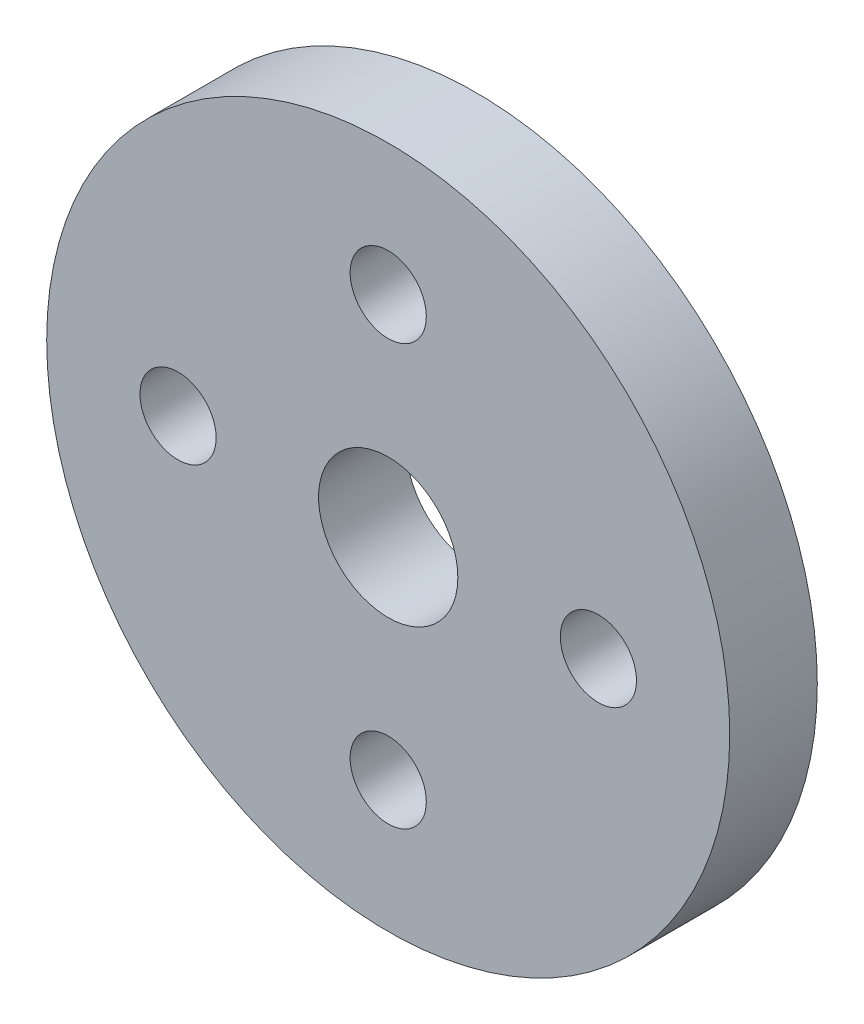
ISO-10303-21;
HEADER;
FILE_DESCRIPTION(('STEP AP214'),'2;1');
FILE_NAME('part.step','',(''),(''),'','','');
FILE_SCHEMA(('AUTOMOTIVE_DESIGN { 1 0 10303 214 1 1 1 1 }'));
ENDSEC;
DATA;
#1=APPLICATION_CONTEXT('core data for automotive mechanical design processes');
#2=APPLICATION_PROTOCOL_DEFINITION('international standard','automotive_design',2000,#1);
#3=PRODUCT_CONTEXT('',#1,'mechanical');
#4=PRODUCT('Part','Part','',(#3));
#5=PRODUCT_RELATED_PRODUCT_CATEGORY('part','',(#4));
#6=PRODUCT_DEFINITION_FORMATION('','',#4);
#7=PRODUCT_DEFINITION_CONTEXT('part definition',#1,'design');
#8=PRODUCT_DEFINITION('design','',#6,#7);
#9=PRODUCT_DEFINITION_SHAPE('','',#8);
#10=(LENGTH_UNIT() NAMED_UNIT(*) SI_UNIT(.MILLI.,.METRE.));
#11=(NAMED_UNIT(*) PLANE_ANGLE_UNIT() SI_UNIT($,.RADIAN.));
#12=(NAMED_UNIT(*) SI_UNIT($,.STERADIAN.) SOLID_ANGLE_UNIT());
#13=UNCERTAINTY_MEASURE_WITH_UNIT(LENGTH_MEASURE(1.E-05),#10,'distance_accuracy_value','');
#14=(GEOMETRIC_REPRESENTATION_CONTEXT(3) GLOBAL_UNCERTAINTY_ASSIGNED_CONTEXT((#13)) GLOBAL_UNIT_ASSIGNED_CONTEXT((#10,
#11,#12)) REPRESENTATION_CONTEXT('',''));
#15=CARTESIAN_POINT('',(0.,0.,0.));
#16=DIRECTION('',(0.,0.,1.));
#17=DIRECTION('',(1.,0.,0.));
#18=AXIS2_PLACEMENT_3D('',#15,#16,#17);
#19=CARTESIAN_POINT('',(0.,0.,5.));
#20=DIRECTION('',(0.,0.,1.));
#21=DIRECTION('',(1.,0.,0.));
#22=AXIS2_PLACEMENT_3D('',#19,#20,#21);
#23=PLANE('',#22);
#24=CARTESIAN_POINT('',(-12.,0.,5.));
#25=DIRECTION('',(0.,0.,1.));
#26=DIRECTION('',(1.,0.,0.));
#27=AXIS2_PLACEMENT_3D('',#24,#25,#26);
#28=CIRCLE('',#27,2.175);
#29=CARTESIAN_POINT('',(-9.825,0.,5.));
#30=VERTEX_POINT('',#29);
#31=EDGE_CURVE('E59',#30,#30,#28,.T.);
#32=ORIENTED_EDGE('',*,*,#31,.F.);
#33=EDGE_LOOP('',(#32));
#34=FACE_BOUND('',#33,.T.);
#35=CARTESIAN_POINT('',(12.,0.,5.));
#36=DIRECTION('',(0.,0.,1.));
#37=DIRECTION('',(1.,0.,0.));
#38=AXIS2_PLACEMENT_3D('',#35,#36,#37);
#39=CIRCLE('',#38,2.175);
#40=CARTESIAN_POINT('',(14.175,0.,5.));
#41=VERTEX_POINT('',#40);
#42=EDGE_CURVE('E47',#41,#41,#39,.T.);
#43=ORIENTED_EDGE('',*,*,#42,.F.);
#44=EDGE_LOOP('',(#43));
#45=FACE_BOUND('',#44,.T.);
#46=CARTESIAN_POINT('',(0.,0.,5.));
#47=DIRECTION('',(0.,0.,1.));
#48=DIRECTION('',(1.,0.,0.));
#49=AXIS2_PLACEMENT_3D('',#46,#47,#48);
#50=CIRCLE('',#49,19.5);
#51=CARTESIAN_POINT('',(19.5,0.,5.));
#52=VERTEX_POINT('',#51);
#53=EDGE_CURVE('E10',#52,#52,#50,.T.);
#54=ORIENTED_EDGE('',*,*,#53,.T.);
#55=EDGE_LOOP('',(#54));
#56=FACE_BOUND('',#55,.T.);
#57=CARTESIAN_POINT('',(0.,0.,5.));
#58=DIRECTION('',(0.,0.,1.));
#59=DIRECTION('',(1.,0.,0.));
#60=AXIS2_PLACEMENT_3D('',#57,#58,#59);
#61=CIRCLE('',#60,3.975);
#62=CARTESIAN_POINT('',(3.975,0.,5.));
#63=VERTEX_POINT('',#62);
#64=EDGE_CURVE('E42',#63,#63,#61,.T.);
#65=ORIENTED_EDGE('',*,*,#64,.F.);
#66=EDGE_LOOP('',(#65));
#67=FACE_BOUND('',#66,.T.);
#68=CARTESIAN_POINT('',(0.,12.,5.));
#69=DIRECTION('',(0.,0.,1.));
#70=DIRECTION('',(1.,0.,0.));
#71=AXIS2_PLACEMENT_3D('',#68,#69,#70);
#72=CIRCLE('',#71,2.175);
#73=CARTESIAN_POINT('',(2.175,12.,5.));
#74=VERTEX_POINT('',#73);
#75=EDGE_CURVE('E53',#74,#74,#72,.T.);
#76=ORIENTED_EDGE('',*,*,#75,.F.);
#77=EDGE_LOOP('',(#76));
#78=FACE_BOUND('',#77,.T.);
#79=CARTESIAN_POINT('',(0.,-12.,5.));
#80=DIRECTION('',(0.,0.,1.));
#81=DIRECTION('',(1.,0.,0.));
#82=AXIS2_PLACEMENT_3D('',#79,#80,#81);
#83=CIRCLE('',#82,2.175);
#84=CARTESIAN_POINT('',(2.175,-12.,5.));
#85=VERTEX_POINT('',#84);
#86=EDGE_CURVE('E65',#85,#85,#83,.T.);
#87=ORIENTED_EDGE('',*,*,#86,.F.);
#88=EDGE_LOOP('',(#87));
#89=FACE_BOUND('',#88,.T.);
#90=ADVANCED_FACE('F31',(#34,#45,#56,#67,#78,#89),#23,.T.);
#91=CARTESIAN_POINT('',(0.,0.,0.));
#92=DIRECTION('',(0.,0.,1.));
#93=DIRECTION('',(1.,0.,0.));
#94=AXIS2_PLACEMENT_3D('',#91,#92,#93);
#95=PLANE('',#94);
#96=CARTESIAN_POINT('',(0.,0.,0.));
#97=DIRECTION('',(0.,0.,1.));
#98=DIRECTION('',(1.,0.,0.));
#99=AXIS2_PLACEMENT_3D('',#96,#97,#98);
#100=CIRCLE('',#99,19.5);
#101=CARTESIAN_POINT('',(19.5,0.,0.));
#102=VERTEX_POINT('',#101);
#103=EDGE_CURVE('E35',#102,#102,#100,.T.);
#104=ORIENTED_EDGE('',*,*,#103,.F.);
#105=EDGE_LOOP('',(#104));
#106=FACE_BOUND('',#105,.T.);
#107=CARTESIAN_POINT('',(0.,0.,0.));
#108=DIRECTION('',(0.,0.,1.));
#109=DIRECTION('',(1.,0.,0.));
#110=AXIS2_PLACEMENT_3D('',#107,#108,#109);
#111=CIRCLE('',#110,3.975);
#112=CARTESIAN_POINT('',(3.975,0.,0.));
#113=VERTEX_POINT('',#112);
#114=EDGE_CURVE('E44',#113,#113,#111,.T.);
#115=ORIENTED_EDGE('',*,*,#114,.T.);
#116=EDGE_LOOP('',(#115));
#117=FACE_BOUND('',#116,.T.);
#118=CARTESIAN_POINT('',(12.,0.,0.));
#119=DIRECTION('',(0.,0.,1.));
#120=DIRECTION('',(1.,0.,0.));
#121=AXIS2_PLACEMENT_3D('',#118,#119,#120);
#122=CIRCLE('',#121,2.175);
#123=CARTESIAN_POINT('',(14.175,0.,0.));
#124=VERTEX_POINT('',#123);
#125=EDGE_CURVE('E50',#124,#124,#122,.T.);
#126=ORIENTED_EDGE('',*,*,#125,.T.);
#127=EDGE_LOOP('',(#126));
#128=FACE_BOUND('',#127,.T.);
#129=CARTESIAN_POINT('',(0.,12.,0.));
#130=DIRECTION('',(0.,0.,1.));
#131=DIRECTION('',(1.,0.,0.));
#132=AXIS2_PLACEMENT_3D('',#129,#130,#131);
#133=CIRCLE('',#132,2.175);
#134=CARTESIAN_POINT('',(2.175,12.,0.));
#135=VERTEX_POINT('',#134);
#136=EDGE_CURVE('E56',#135,#135,#133,.T.);
#137=ORIENTED_EDGE('',*,*,#136,.T.);
#138=EDGE_LOOP('',(#137));
#139=FACE_BOUND('',#138,.T.);
#140=CARTESIAN_POINT('',(-12.,0.,0.));
#141=DIRECTION('',(0.,0.,1.));
#142=DIRECTION('',(1.,0.,0.));
#143=AXIS2_PLACEMENT_3D('',#140,#141,#142);
#144=CIRCLE('',#143,2.175);
#145=CARTESIAN_POINT('',(-9.825,0.,0.));
#146=VERTEX_POINT('',#145);
#147=EDGE_CURVE('E62',#146,#146,#144,.T.);
#148=ORIENTED_EDGE('',*,*,#147,.T.);
#149=EDGE_LOOP('',(#148));
#150=FACE_BOUND('',#149,.T.);
#151=CARTESIAN_POINT('',(0.,-12.,0.));
#152=DIRECTION('',(0.,0.,1.));
#153=DIRECTION('',(1.,0.,0.));
#154=AXIS2_PLACEMENT_3D('',#151,#152,#153);
#155=CIRCLE('',#154,2.175);
#156=CARTESIAN_POINT('',(2.175,-12.,0.));
#157=VERTEX_POINT('',#156);
#158=EDGE_CURVE('E68',#157,#157,#155,.T.);
#159=ORIENTED_EDGE('',*,*,#158,.T.);
#160=EDGE_LOOP('',(#159));
#161=FACE_BOUND('',#160,.T.);
#162=ADVANCED_FACE('F78',(#106,#117,#128,#139,#150,#161),#95,.F.);
#163=CARTESIAN_POINT('',(0.,0.,5.));
#164=DIRECTION('',(0.,0.,-1.));
#165=DIRECTION('',(-1.,0.,0.));
#166=AXIS2_PLACEMENT_3D('',#163,#164,#165);
#167=CYLINDRICAL_SURFACE('',#166,19.5);
#168=ORIENTED_EDGE('',*,*,#53,.F.);
#169=EDGE_LOOP('',(#168));
#170=FACE_BOUND('',#169,.T.);
#171=ORIENTED_EDGE('',*,*,#103,.T.);
#172=EDGE_LOOP('',(#171));
#173=FACE_BOUND('',#172,.T.);
#174=ADVANCED_FACE('F33',(#170,#173),#167,.T.);
#175=CARTESIAN_POINT('',(0.,0.,5.));
#176=DIRECTION('',(0.,0.,-1.));
#177=DIRECTION('',(-1.,0.,0.));
#178=AXIS2_PLACEMENT_3D('',#175,#176,#177);
#179=CYLINDRICAL_SURFACE('',#178,3.975);
#180=ORIENTED_EDGE('',*,*,#64,.T.);
#181=EDGE_LOOP('',(#180));
#182=FACE_BOUND('',#181,.T.);
#183=ORIENTED_EDGE('',*,*,#114,.F.);
#184=EDGE_LOOP('',(#183));
#185=FACE_BOUND('',#184,.T.);
#186=ADVANCED_FACE('F88',(#182,#185),#179,.F.);
#187=CARTESIAN_POINT('',(12.,0.,5.));
#188=DIRECTION('',(0.,0.,-1.));
#189=DIRECTION('',(-1.,0.,0.));
#190=AXIS2_PLACEMENT_3D('',#187,#188,#189);
#191=CYLINDRICAL_SURFACE('',#190,2.175);
#192=ORIENTED_EDGE('',*,*,#42,.T.);
#193=EDGE_LOOP('',(#192));
#194=FACE_BOUND('',#193,.T.);
#195=ORIENTED_EDGE('',*,*,#125,.F.);
#196=EDGE_LOOP('',(#195));
#197=FACE_BOUND('',#196,.T.);
#198=ADVANCED_FACE('F91',(#194,#197),#191,.F.);
#199=CARTESIAN_POINT('',(0.,12.,5.));
#200=DIRECTION('',(0.,0.,-1.));
#201=DIRECTION('',(-1.,0.,0.));
#202=AXIS2_PLACEMENT_3D('',#199,#200,#201);
#203=CYLINDRICAL_SURFACE('',#202,2.175);
#204=ORIENTED_EDGE('',*,*,#75,.T.);
#205=EDGE_LOOP('',(#204));
#206=FACE_BOUND('',#205,.T.);
#207=ORIENTED_EDGE('',*,*,#136,.F.);
#208=EDGE_LOOP('',(#207));
#209=FACE_BOUND('',#208,.T.);
#210=ADVANCED_FACE('F95',(#206,#209),#203,.F.);
#211=CARTESIAN_POINT('',(-12.,0.,5.));
#212=DIRECTION('',(0.,0.,-1.));
#213=DIRECTION('',(-1.,0.,0.));
#214=AXIS2_PLACEMENT_3D('',#211,#212,#213);
#215=CYLINDRICAL_SURFACE('',#214,2.175);
#216=ORIENTED_EDGE('',*,*,#31,.T.);
#217=EDGE_LOOP('',(#216));
#218=FACE_BOUND('',#217,.T.);
#219=ORIENTED_EDGE('',*,*,#147,.F.);
#220=EDGE_LOOP('',(#219));
#221=FACE_BOUND('',#220,.T.);
#222=ADVANCED_FACE('F99',(#218,#221),#215,.F.);
#223=CARTESIAN_POINT('',(0.,-12.,5.));
#224=DIRECTION('',(0.,0.,-1.));
#225=DIRECTION('',(-1.,0.,0.));
#226=AXIS2_PLACEMENT_3D('',#223,#224,#225);
#227=CYLINDRICAL_SURFACE('',#226,2.175);
#228=ORIENTED_EDGE('',*,*,#86,.T.);
#229=EDGE_LOOP('',(#228));
#230=FACE_BOUND('',#229,.T.);
#231=ORIENTED_EDGE('',*,*,#158,.F.);
#232=EDGE_LOOP('',(#231));
#233=FACE_BOUND('',#232,.T.);
#234=ADVANCED_FACE('F74',(#230,#233),#227,.F.);
#235=CLOSED_SHELL('',(#90,#162,#174,#186,#198,#210,#222,#234));
#236=MANIFOLD_SOLID_BREP('B2',#235);
#237=ADVANCED_BREP_SHAPE_REPRESENTATION('',(#18,#236),#14);
#238=SHAPE_DEFINITION_REPRESENTATION(#9,#237);
ENDSEC;
END-ISO-10303-21;
